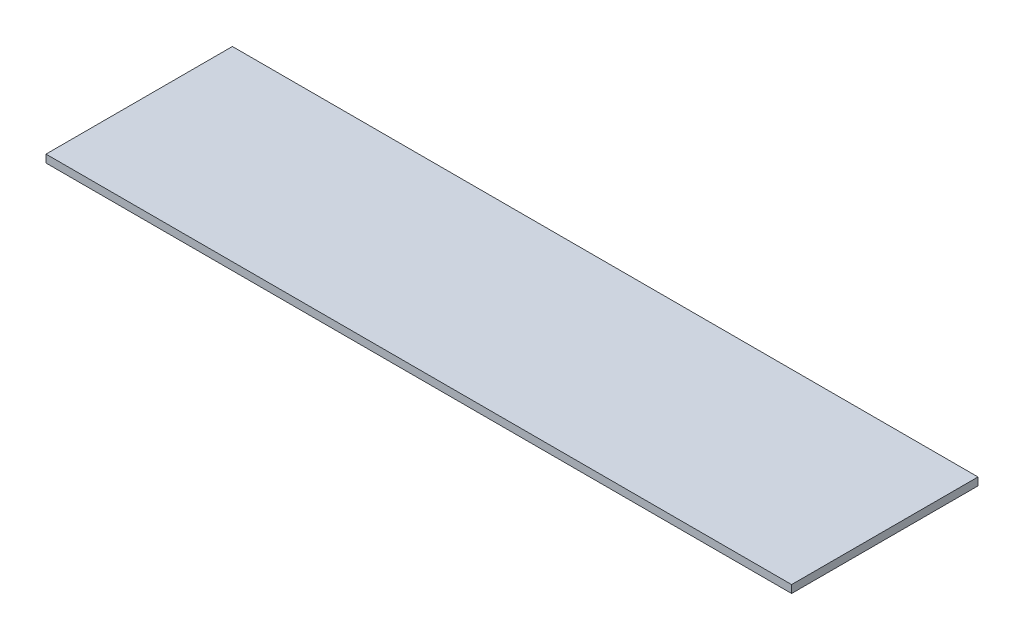
ISO-10303-21;
HEADER;
FILE_DESCRIPTION(('STEP AP214'),'2;1');
FILE_NAME('part.step','',(''),(''),'','','');
FILE_SCHEMA(('AUTOMOTIVE_DESIGN { 1 0 10303 214 1 1 1 1 }'));
ENDSEC;
DATA;
#1=APPLICATION_CONTEXT('core data for automotive mechanical design processes');
#2=APPLICATION_PROTOCOL_DEFINITION('international standard','automotive_design',2000,#1);
#3=PRODUCT_CONTEXT('',#1,'mechanical');
#4=PRODUCT('Part','Part','',(#3));
#5=PRODUCT_RELATED_PRODUCT_CATEGORY('part','',(#4));
#6=PRODUCT_DEFINITION_FORMATION('','',#4);
#7=PRODUCT_DEFINITION_CONTEXT('part definition',#1,'design');
#8=PRODUCT_DEFINITION('design','',#6,#7);
#9=PRODUCT_DEFINITION_SHAPE('','',#8);
#10=(LENGTH_UNIT() NAMED_UNIT(*) SI_UNIT(.MILLI.,.METRE.));
#11=(NAMED_UNIT(*) PLANE_ANGLE_UNIT() SI_UNIT($,.RADIAN.));
#12=(NAMED_UNIT(*) SI_UNIT($,.STERADIAN.) SOLID_ANGLE_UNIT());
#13=UNCERTAINTY_MEASURE_WITH_UNIT(LENGTH_MEASURE(1.E-05),#10,'distance_accuracy_value','');
#14=(GEOMETRIC_REPRESENTATION_CONTEXT(3) GLOBAL_UNCERTAINTY_ASSIGNED_CONTEXT((#13)) GLOBAL_UNIT_ASSIGNED_CONTEXT((#10,
#11,#12)) REPRESENTATION_CONTEXT('',''));
#15=CARTESIAN_POINT('',(0.,0.,0.));
#16=DIRECTION('',(0.,0.,1.));
#17=DIRECTION('',(1.,0.,0.));
#18=AXIS2_PLACEMENT_3D('',#15,#16,#17);
#19=CARTESIAN_POINT('',(304.8,6.35,-76.2));
#20=DIRECTION('',(-1.,0.,0.));
#21=DIRECTION('',(0.,0.,1.));
#22=AXIS2_PLACEMENT_3D('',#19,#20,#21);
#23=PLANE('',#22);
#24=DIRECTION('',(0.,0.,-1.));
#25=VECTOR('',#24,1.);
#26=CARTESIAN_POINT('',(304.8,0.,-76.2));
#27=LINE('',#26,#25);
#28=CARTESIAN_POINT('',(304.8,0.,76.2));
#29=VERTEX_POINT('',#28);
#30=CARTESIAN_POINT('',(304.8,0.,-76.2));
#31=VERTEX_POINT('',#30);
#32=EDGE_CURVE('E94',#29,#31,#27,.T.);
#33=ORIENTED_EDGE('',*,*,#32,.T.);
#34=DIRECTION('',(0.,-1.,0.));
#35=VECTOR('',#34,1.);
#36=CARTESIAN_POINT('',(304.8,6.35,-76.2));
#37=LINE('',#36,#35);
#38=CARTESIAN_POINT('',(304.8,6.35,-76.2));
#39=VERTEX_POINT('',#38);
#40=EDGE_CURVE('E11',#39,#31,#37,.T.);
#41=ORIENTED_EDGE('',*,*,#40,.F.);
#42=DIRECTION('',(0.,0.,-1.));
#43=VECTOR('',#42,1.);
#44=CARTESIAN_POINT('',(304.8,6.35,-76.2));
#45=LINE('',#44,#43);
#46=CARTESIAN_POINT('',(304.8,6.35,76.2));
#47=VERTEX_POINT('',#46);
#48=EDGE_CURVE('E82',#47,#39,#45,.T.);
#49=ORIENTED_EDGE('',*,*,#48,.F.);
#50=DIRECTION('',(0.,-1.,0.));
#51=VECTOR('',#50,1.);
#52=CARTESIAN_POINT('',(304.8,6.35,76.2));
#53=LINE('',#52,#51);
#54=EDGE_CURVE('E90',#47,#29,#53,.T.);
#55=ORIENTED_EDGE('',*,*,#54,.T.);
#56=EDGE_LOOP('',(#33,#41,#49,#55));
#57=FACE_BOUND('',#56,.T.);
#58=ADVANCED_FACE('F31',(#57),#23,.F.);
#59=CARTESIAN_POINT('',(-304.8,6.35,-76.2));
#60=DIRECTION('',(0.,0.,1.));
#61=DIRECTION('',(1.,0.,0.));
#62=AXIS2_PLACEMENT_3D('',#59,#60,#61);
#63=PLANE('',#62);
#64=DIRECTION('',(-1.,0.,0.));
#65=VECTOR('',#64,1.);
#66=CARTESIAN_POINT('',(-304.8,0.,-76.2));
#67=LINE('',#66,#65);
#68=CARTESIAN_POINT('',(-304.8,0.,-76.2));
#69=VERTEX_POINT('',#68);
#70=EDGE_CURVE('E86',#31,#69,#67,.T.);
#71=ORIENTED_EDGE('',*,*,#70,.T.);
#72=DIRECTION('',(0.,-1.,0.));
#73=VECTOR('',#72,1.);
#74=CARTESIAN_POINT('',(-304.8,6.35,-76.2));
#75=LINE('',#74,#73);
#76=CARTESIAN_POINT('',(-304.8,6.35,-76.2));
#77=VERTEX_POINT('',#76);
#78=EDGE_CURVE('E39',#77,#69,#75,.T.);
#79=ORIENTED_EDGE('',*,*,#78,.F.);
#80=DIRECTION('',(-1.,0.,0.));
#81=VECTOR('',#80,1.);
#82=CARTESIAN_POINT('',(-304.8,6.35,-76.2));
#83=LINE('',#82,#81);
#84=EDGE_CURVE('E77',#39,#77,#83,.T.);
#85=ORIENTED_EDGE('',*,*,#84,.F.);
#86=ORIENTED_EDGE('',*,*,#40,.T.);
#87=EDGE_LOOP('',(#71,#79,#85,#86));
#88=FACE_BOUND('',#87,.T.);
#89=ADVANCED_FACE('F85',(#88),#63,.F.);
#90=CARTESIAN_POINT('',(-304.8,6.35,-76.2));
#91=DIRECTION('',(1.,0.,0.));
#92=DIRECTION('',(0.,0.,-1.));
#93=AXIS2_PLACEMENT_3D('',#90,#91,#92);
#94=PLANE('',#93);
#95=DIRECTION('',(0.,0.,1.));
#96=VECTOR('',#95,1.);
#97=CARTESIAN_POINT('',(-304.8,0.,-76.2));
#98=LINE('',#97,#96);
#99=CARTESIAN_POINT('',(-304.8,0.,76.2));
#100=VERTEX_POINT('',#99);
#101=EDGE_CURVE('E64',#69,#100,#98,.T.);
#102=ORIENTED_EDGE('',*,*,#101,.T.);
#103=DIRECTION('',(0.,-1.,0.));
#104=VECTOR('',#103,1.);
#105=CARTESIAN_POINT('',(-304.8,6.35,76.2));
#106=LINE('',#105,#104);
#107=CARTESIAN_POINT('',(-304.8,6.35,76.2));
#108=VERTEX_POINT('',#107);
#109=EDGE_CURVE('E87',#108,#100,#106,.T.);
#110=ORIENTED_EDGE('',*,*,#109,.F.);
#111=DIRECTION('',(0.,0.,1.));
#112=VECTOR('',#111,1.);
#113=CARTESIAN_POINT('',(-304.8,6.35,-76.2));
#114=LINE('',#113,#112);
#115=EDGE_CURVE('E80',#77,#108,#114,.T.);
#116=ORIENTED_EDGE('',*,*,#115,.F.);
#117=ORIENTED_EDGE('',*,*,#78,.T.);
#118=EDGE_LOOP('',(#102,#110,#116,#117));
#119=FACE_BOUND('',#118,.T.);
#120=ADVANCED_FACE('F88',(#119),#94,.F.);
#121=CARTESIAN_POINT('',(-304.8,6.35,76.2));
#122=DIRECTION('',(0.,0.,-1.));
#123=DIRECTION('',(-1.,0.,0.));
#124=AXIS2_PLACEMENT_3D('',#121,#122,#123);
#125=PLANE('',#124);
#126=DIRECTION('',(1.,0.,0.));
#127=VECTOR('',#126,1.);
#128=CARTESIAN_POINT('',(-304.8,0.,76.2));
#129=LINE('',#128,#127);
#130=EDGE_CURVE('E70',#100,#29,#129,.T.);
#131=ORIENTED_EDGE('',*,*,#130,.T.);
#132=ORIENTED_EDGE('',*,*,#54,.F.);
#133=DIRECTION('',(1.,0.,0.));
#134=VECTOR('',#133,1.);
#135=CARTESIAN_POINT('',(-304.8,6.35,76.2));
#136=LINE('',#135,#134);
#137=EDGE_CURVE('E47',#108,#47,#136,.T.);
#138=ORIENTED_EDGE('',*,*,#137,.F.);
#139=ORIENTED_EDGE('',*,*,#109,.T.);
#140=EDGE_LOOP('',(#131,#132,#138,#139));
#141=FACE_BOUND('',#140,.T.);
#142=ADVANCED_FACE('F101',(#141),#125,.F.);
#143=CARTESIAN_POINT('',(304.8,6.35,76.2));
#144=DIRECTION('',(0.,1.,0.));
#145=DIRECTION('',(0.,0.,1.));
#146=AXIS2_PLACEMENT_3D('',#143,#144,#145);
#147=PLANE('',#146);
#148=ORIENTED_EDGE('',*,*,#48,.T.);
#149=ORIENTED_EDGE('',*,*,#84,.T.);
#150=ORIENTED_EDGE('',*,*,#115,.T.);
#151=ORIENTED_EDGE('',*,*,#137,.T.);
#152=EDGE_LOOP('',(#148,#149,#150,#151));
#153=FACE_BOUND('',#152,.T.);
#154=ADVANCED_FACE('F78',(#153),#147,.T.);
#155=CARTESIAN_POINT('',(304.8,0.,76.2));
#156=DIRECTION('',(0.,1.,0.));
#157=DIRECTION('',(0.,0.,1.));
#158=AXIS2_PLACEMENT_3D('',#155,#156,#157);
#159=PLANE('',#158);
#160=ORIENTED_EDGE('',*,*,#32,.F.);
#161=ORIENTED_EDGE('',*,*,#130,.F.);
#162=ORIENTED_EDGE('',*,*,#101,.F.);
#163=ORIENTED_EDGE('',*,*,#70,.F.);
#164=EDGE_LOOP('',(#160,#161,#162,#163));
#165=FACE_BOUND('',#164,.T.);
#166=ADVANCED_FACE('F104',(#165),#159,.F.);
#167=CLOSED_SHELL('',(#58,#89,#120,#142,#154,#166));
#168=MANIFOLD_SOLID_BREP('B2',#167);
#169=ADVANCED_BREP_SHAPE_REPRESENTATION('',(#18,#168),#14);
#170=SHAPE_DEFINITION_REPRESENTATION(#9,#169);
ENDSEC;
END-ISO-10303-21;
